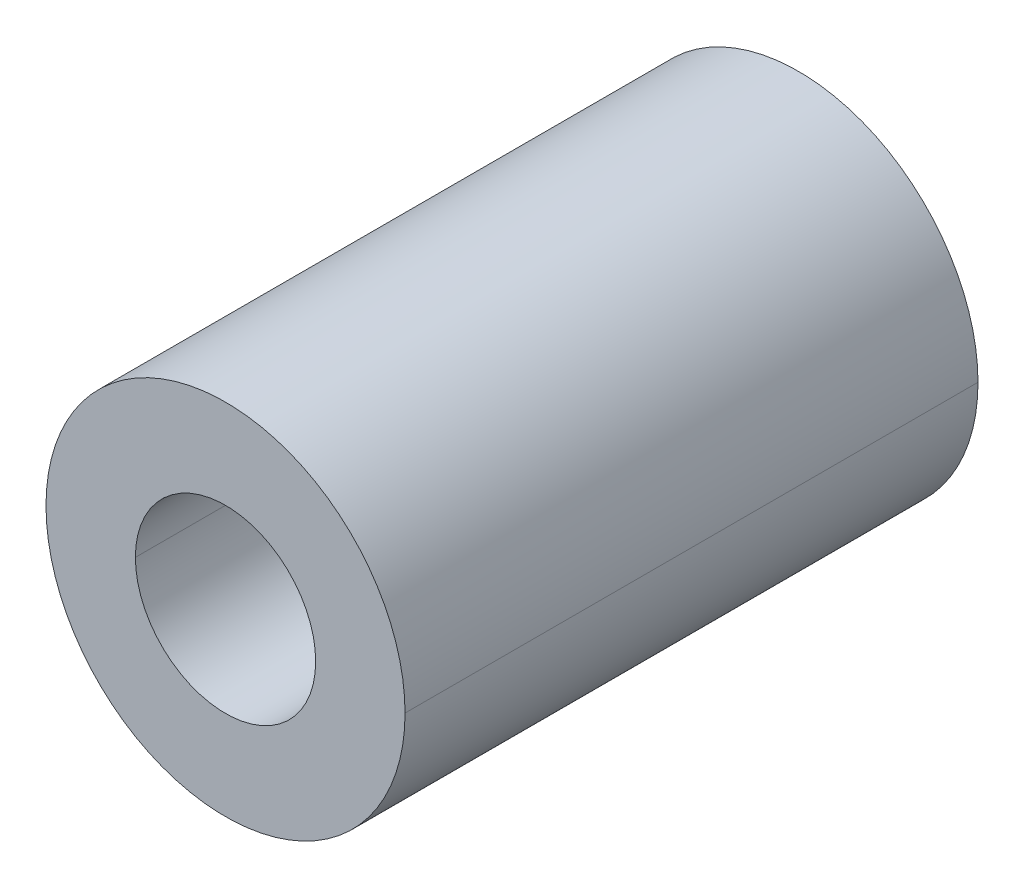
ISO-10303-21;
HEADER;
FILE_DESCRIPTION(('STEP AP214'),'2;1');
FILE_NAME('part.step','',(''),(''),'','','');
FILE_SCHEMA(('AUTOMOTIVE_DESIGN { 1 0 10303 214 1 1 1 1 }'));
ENDSEC;
DATA;
#1=APPLICATION_CONTEXT('core data for automotive mechanical design processes');
#2=APPLICATION_PROTOCOL_DEFINITION('international standard','automotive_design',2000,#1);
#3=PRODUCT_CONTEXT('',#1,'mechanical');
#4=PRODUCT('Part','Part','',(#3));
#5=PRODUCT_RELATED_PRODUCT_CATEGORY('part','',(#4));
#6=PRODUCT_DEFINITION_FORMATION('','',#4);
#7=PRODUCT_DEFINITION_CONTEXT('part definition',#1,'design');
#8=PRODUCT_DEFINITION('design','',#6,#7);
#9=PRODUCT_DEFINITION_SHAPE('','',#8);
#10=(LENGTH_UNIT() NAMED_UNIT(*) SI_UNIT(.MILLI.,.METRE.));
#11=(NAMED_UNIT(*) PLANE_ANGLE_UNIT() SI_UNIT($,.RADIAN.));
#12=(NAMED_UNIT(*) SI_UNIT($,.STERADIAN.) SOLID_ANGLE_UNIT());
#13=UNCERTAINTY_MEASURE_WITH_UNIT(LENGTH_MEASURE(1.E-05),#10,'distance_accuracy_value','');
#14=(GEOMETRIC_REPRESENTATION_CONTEXT(3) GLOBAL_UNCERTAINTY_ASSIGNED_CONTEXT((#13)) GLOBAL_UNIT_ASSIGNED_CONTEXT((#10,
#11,#12)) REPRESENTATION_CONTEXT('',''));
#15=CARTESIAN_POINT('',(0.,0.,0.));
#16=DIRECTION('',(0.,0.,1.));
#17=DIRECTION('',(1.,0.,0.));
#18=AXIS2_PLACEMENT_3D('',#15,#16,#17);
#19=CARTESIAN_POINT('',(0.,0.,0.));
#20=DIRECTION('',(0.,0.,-1.));
#21=DIRECTION('',(-1.,0.,0.));
#22=AXIS2_PLACEMENT_3D('',#19,#20,#21);
#23=PLANE('',#22);
#24=CARTESIAN_POINT('',(0.,0.,0.));
#25=DIRECTION('',(0.,0.,-1.));
#26=DIRECTION('',(-1.,0.,0.));
#27=AXIS2_PLACEMENT_3D('',#24,#25,#26);
#28=CIRCLE('',#27,2.9845);
#29=CARTESIAN_POINT('',(2.9845,0.,0.));
#30=VERTEX_POINT('',#29);
#31=CARTESIAN_POINT('',(-2.9845,0.,0.));
#32=VERTEX_POINT('',#31);
#33=EDGE_CURVE('E11',#30,#32,#28,.T.);
#34=ORIENTED_EDGE('',*,*,#33,.F.);
#35=CARTESIAN_POINT('',(0.,0.,0.));
#36=DIRECTION('',(0.,0.,-1.));
#37=DIRECTION('',(-1.,0.,0.));
#38=AXIS2_PLACEMENT_3D('',#35,#36,#37);
#39=CIRCLE('',#38,2.9845);
#40=EDGE_CURVE('E24',#32,#30,#39,.T.);
#41=ORIENTED_EDGE('',*,*,#40,.F.);
#42=EDGE_LOOP('',(#34,#41));
#43=FACE_BOUND('',#42,.T.);
#44=CARTESIAN_POINT('',(0.,0.,0.));
#45=DIRECTION('',(0.,0.,1.));
#46=DIRECTION('',(1.,0.,0.));
#47=AXIS2_PLACEMENT_3D('',#44,#45,#46);
#48=CIRCLE('',#47,1.4986);
#49=CARTESIAN_POINT('',(-1.4986,0.,0.));
#50=VERTEX_POINT('',#49);
#51=CARTESIAN_POINT('',(1.4986,0.,0.));
#52=VERTEX_POINT('',#51);
#53=EDGE_CURVE('E100',#50,#52,#48,.T.);
#54=ORIENTED_EDGE('',*,*,#53,.F.);
#55=CARTESIAN_POINT('',(0.,0.,0.));
#56=DIRECTION('',(0.,0.,1.));
#57=DIRECTION('',(1.,0.,0.));
#58=AXIS2_PLACEMENT_3D('',#55,#56,#57);
#59=CIRCLE('',#58,1.4986);
#60=EDGE_CURVE('E95',#52,#50,#59,.T.);
#61=ORIENTED_EDGE('',*,*,#60,.F.);
#62=EDGE_LOOP('',(#54,#61));
#63=FACE_BOUND('',#62,.T.);
#64=ADVANCED_FACE('F16',(#43,#63),#23,.F.);
#65=CARTESIAN_POINT('',(0.,0.,-9.525));
#66=DIRECTION('',(0.,0.,1.));
#67=DIRECTION('',(0.,-1.,0.));
#68=AXIS2_PLACEMENT_3D('',#65,#66,#67);
#69=CYLINDRICAL_SURFACE('',#68,1.4986);
#70=DIRECTION('',(0.,0.,1.));
#71=VECTOR('',#70,1.);
#72=CARTESIAN_POINT('',(-1.4986,0.,-9.525));
#73=LINE('',#72,#71);
#74=CARTESIAN_POINT('',(-1.4986,0.,-9.525));
#75=VERTEX_POINT('',#74);
#76=EDGE_CURVE('E90',#75,#50,#73,.T.);
#77=ORIENTED_EDGE('',*,*,#76,.F.);
#78=CARTESIAN_POINT('',(0.,0.,-9.525));
#79=DIRECTION('',(0.,0.,1.));
#80=DIRECTION('',(1.,0.,0.));
#81=AXIS2_PLACEMENT_3D('',#78,#79,#80);
#82=CIRCLE('',#81,1.4986);
#83=CARTESIAN_POINT('',(1.4986,0.,-9.525));
#84=VERTEX_POINT('',#83);
#85=EDGE_CURVE('E85',#84,#75,#82,.T.);
#86=ORIENTED_EDGE('',*,*,#85,.F.);
#87=DIRECTION('',(0.,0.,1.));
#88=VECTOR('',#87,1.);
#89=CARTESIAN_POINT('',(1.4986,0.,-9.525));
#90=LINE('',#89,#88);
#91=EDGE_CURVE('E80',#84,#52,#90,.T.);
#92=ORIENTED_EDGE('',*,*,#91,.T.);
#93=ORIENTED_EDGE('',*,*,#60,.T.);
#94=EDGE_LOOP('',(#77,#86,#92,#93));
#95=FACE_BOUND('',#94,.T.);
#96=ADVANCED_FACE('F115',(#95),#69,.F.);
#97=CARTESIAN_POINT('',(0.,0.,-9.525));
#98=DIRECTION('',(0.,0.,1.));
#99=DIRECTION('',(0.,1.,0.));
#100=AXIS2_PLACEMENT_3D('',#97,#98,#99);
#101=CYLINDRICAL_SURFACE('',#100,1.4986);
#102=ORIENTED_EDGE('',*,*,#76,.T.);
#103=ORIENTED_EDGE('',*,*,#53,.T.);
#104=ORIENTED_EDGE('',*,*,#91,.F.);
#105=CARTESIAN_POINT('',(0.,0.,-9.525));
#106=DIRECTION('',(0.,0.,1.));
#107=DIRECTION('',(1.,0.,0.));
#108=AXIS2_PLACEMENT_3D('',#105,#106,#107);
#109=CIRCLE('',#108,1.4986);
#110=EDGE_CURVE('E64',#75,#84,#109,.T.);
#111=ORIENTED_EDGE('',*,*,#110,.F.);
#112=EDGE_LOOP('',(#102,#103,#104,#111));
#113=FACE_BOUND('',#112,.T.);
#114=ADVANCED_FACE('F111',(#113),#101,.F.);
#115=CARTESIAN_POINT('',(0.,2.9845,-9.525));
#116=DIRECTION('',(0.,0.,1.));
#117=DIRECTION('',(1.,0.,0.));
#118=AXIS2_PLACEMENT_3D('',#115,#116,#117);
#119=PLANE('',#118);
#120=ORIENTED_EDGE('',*,*,#85,.T.);
#121=ORIENTED_EDGE('',*,*,#110,.T.);
#122=EDGE_LOOP('',(#120,#121));
#123=FACE_BOUND('',#122,.T.);
#124=CARTESIAN_POINT('',(0.,0.,-9.525));
#125=DIRECTION('',(0.,0.,-1.));
#126=DIRECTION('',(-1.,0.,0.));
#127=AXIS2_PLACEMENT_3D('',#124,#125,#126);
#128=CIRCLE('',#127,2.9845);
#129=CARTESIAN_POINT('',(-2.9845,0.,-9.525));
#130=VERTEX_POINT('',#129);
#131=CARTESIAN_POINT('',(2.9845,0.,-9.525));
#132=VERTEX_POINT('',#131);
#133=EDGE_CURVE('E55',#130,#132,#128,.T.);
#134=ORIENTED_EDGE('',*,*,#133,.T.);
#135=CARTESIAN_POINT('',(0.,0.,-9.525));
#136=DIRECTION('',(0.,0.,-1.));
#137=DIRECTION('',(-1.,0.,0.));
#138=AXIS2_PLACEMENT_3D('',#135,#136,#137);
#139=CIRCLE('',#138,2.9845);
#140=EDGE_CURVE('E52',#132,#130,#139,.T.);
#141=ORIENTED_EDGE('',*,*,#140,.T.);
#142=EDGE_LOOP('',(#134,#141));
#143=FACE_BOUND('',#142,.T.);
#144=ADVANCED_FACE('F54',(#123,#143),#119,.F.);
#145=CARTESIAN_POINT('',(0.,0.,-9.525));
#146=DIRECTION('',(0.,0.,-1.));
#147=DIRECTION('',(0.,1.,0.));
#148=AXIS2_PLACEMENT_3D('',#145,#146,#147);
#149=CYLINDRICAL_SURFACE('',#148,2.9845);
#150=DIRECTION('',(0.,0.,-1.));
#151=VECTOR('',#150,1.);
#152=CARTESIAN_POINT('',(2.9845,0.,0.));
#153=LINE('',#152,#151);
#154=EDGE_CURVE('E59',#30,#132,#153,.T.);
#155=ORIENTED_EDGE('',*,*,#154,.F.);
#156=ORIENTED_EDGE('',*,*,#33,.T.);
#157=DIRECTION('',(0.,0.,-1.));
#158=VECTOR('',#157,1.);
#159=CARTESIAN_POINT('',(-2.9845,0.,0.));
#160=LINE('',#159,#158);
#161=EDGE_CURVE('E63',#32,#130,#160,.T.);
#162=ORIENTED_EDGE('',*,*,#161,.T.);
#163=ORIENTED_EDGE('',*,*,#140,.F.);
#164=EDGE_LOOP('',(#155,#156,#162,#163));
#165=FACE_BOUND('',#164,.T.);
#166=ADVANCED_FACE('F66',(#165),#149,.T.);
#167=CARTESIAN_POINT('',(0.,0.,-9.525));
#168=DIRECTION('',(0.,0.,-1.));
#169=DIRECTION('',(0.,-1.,0.));
#170=AXIS2_PLACEMENT_3D('',#167,#168,#169);
#171=CYLINDRICAL_SURFACE('',#170,2.9845);
#172=ORIENTED_EDGE('',*,*,#154,.T.);
#173=ORIENTED_EDGE('',*,*,#133,.F.);
#174=ORIENTED_EDGE('',*,*,#161,.F.);
#175=ORIENTED_EDGE('',*,*,#40,.T.);
#176=EDGE_LOOP('',(#172,#173,#174,#175));
#177=FACE_BOUND('',#176,.T.);
#178=ADVANCED_FACE('F62',(#177),#171,.T.);
#179=CLOSED_SHELL('',(#64,#96,#114,#144,#166,#178));
#180=MANIFOLD_SOLID_BREP('B1',#179);
#181=ADVANCED_BREP_SHAPE_REPRESENTATION('',(#18,#180),#14);
#182=SHAPE_DEFINITION_REPRESENTATION(#9,#181);
ENDSEC;
END-ISO-10303-21;
